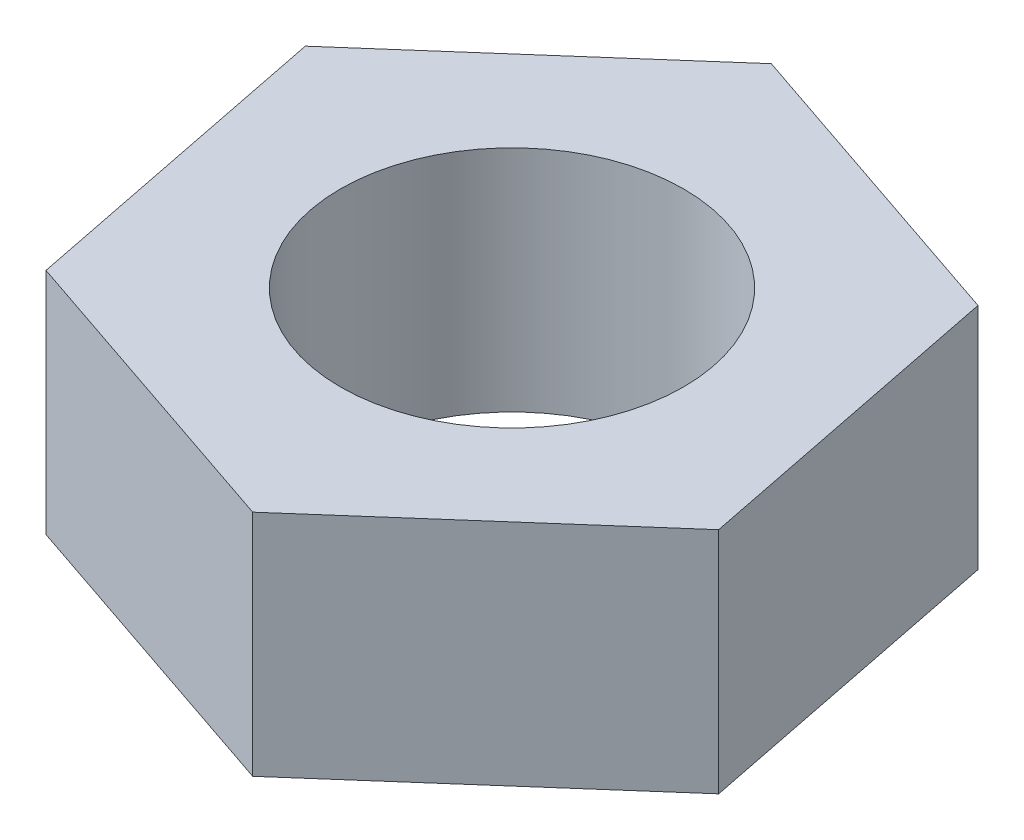
ISO-10303-21;
HEADER;
FILE_DESCRIPTION(('STEP AP214'),'2;1');
FILE_NAME('part.step','',(''),(''),'','','');
FILE_SCHEMA(('AUTOMOTIVE_DESIGN { 1 0 10303 214 1 1 1 1 }'));
ENDSEC;
DATA;
#1=APPLICATION_CONTEXT('core data for automotive mechanical design processes');
#2=APPLICATION_PROTOCOL_DEFINITION('international standard','automotive_design',2000,#1);
#3=PRODUCT_CONTEXT('',#1,'mechanical');
#4=PRODUCT('Part','Part','',(#3));
#5=PRODUCT_RELATED_PRODUCT_CATEGORY('part','',(#4));
#6=PRODUCT_DEFINITION_FORMATION('','',#4);
#7=PRODUCT_DEFINITION_CONTEXT('part definition',#1,'design');
#8=PRODUCT_DEFINITION('design','',#6,#7);
#9=PRODUCT_DEFINITION_SHAPE('','',#8);
#10=(LENGTH_UNIT() NAMED_UNIT(*) SI_UNIT(.MILLI.,.METRE.));
#11=(NAMED_UNIT(*) PLANE_ANGLE_UNIT() SI_UNIT($,.RADIAN.));
#12=(NAMED_UNIT(*) SI_UNIT($,.STERADIAN.) SOLID_ANGLE_UNIT());
#13=UNCERTAINTY_MEASURE_WITH_UNIT(LENGTH_MEASURE(1.E-05),#10,'distance_accuracy_value','');
#14=(GEOMETRIC_REPRESENTATION_CONTEXT(3) GLOBAL_UNCERTAINTY_ASSIGNED_CONTEXT((#13)) GLOBAL_UNIT_ASSIGNED_CONTEXT((#10,
#11,#12)) REPRESENTATION_CONTEXT('',''));
#15=CARTESIAN_POINT('',(0.,0.,0.));
#16=DIRECTION('',(0.,0.,1.));
#17=DIRECTION('',(1.,0.,0.));
#18=AXIS2_PLACEMENT_3D('',#15,#16,#17);
#19=CARTESIAN_POINT('',(8.24528714497441,10.,9.39495821687994));
#20=DIRECTION('',(-0.659622971597953,0.,-0.751596657350395));
#21=DIRECTION('',(-0.751596657350395,0.,0.659622971597953));
#22=AXIS2_PLACEMENT_3D('',#19,#20,#21);
#23=PLANE('',#22);
#24=DIRECTION('',(0.751596657350395,0.,-0.659622971597953));
#25=VECTOR('',#24,1.);
#26=CARTESIAN_POINT('',(8.24528714497441,0.,9.39495821687994));
#27=LINE('',#26,#25);
#28=CARTESIAN_POINT('',(2.82110548943349,0.,14.1553769695767));
#29=VERTEX_POINT('',#28);
#30=CARTESIAN_POINT('',(13.6694688005153,0.,4.6345394641832));
#31=VERTEX_POINT('',#30);
#32=EDGE_CURVE('E124',#29,#31,#27,.T.);
#33=ORIENTED_EDGE('',*,*,#32,.T.);
#34=DIRECTION('',(0.,-1.,0.));
#35=VECTOR('',#34,1.);
#36=CARTESIAN_POINT('',(13.6694688005153,10.,4.6345394641832));
#37=LINE('',#36,#35);
#38=CARTESIAN_POINT('',(13.6694688005153,10.,4.6345394641832));
#39=VERTEX_POINT('',#38);
#40=EDGE_CURVE('E11',#39,#31,#37,.T.);
#41=ORIENTED_EDGE('',*,*,#40,.F.);
#42=DIRECTION('',(0.751596657350395,0.,-0.659622971597953));
#43=VECTOR('',#42,1.);
#44=CARTESIAN_POINT('',(8.24528714497441,10.,9.39495821687994));
#45=LINE('',#44,#43);
#46=CARTESIAN_POINT('',(2.82110548943349,10.,14.1553769695767));
#47=VERTEX_POINT('',#46);
#48=EDGE_CURVE('E147',#47,#39,#45,.T.);
#49=ORIENTED_EDGE('',*,*,#48,.F.);
#50=DIRECTION('',(0.,-1.,0.));
#51=VECTOR('',#50,1.);
#52=CARTESIAN_POINT('',(2.82110548943349,10.,14.1553769695767));
#53=LINE('',#52,#51);
#54=EDGE_CURVE('E117',#47,#29,#53,.T.);
#55=ORIENTED_EDGE('',*,*,#54,.T.);
#56=EDGE_LOOP('',(#33,#41,#49,#55));
#57=FACE_BOUND('',#56,.T.);
#58=ADVANCED_FACE('F36',(#57),#23,.F.);
#59=CARTESIAN_POINT('',(12.2589160557986,10.,-2.44314902060514));
#60=DIRECTION('',(-0.980713284463886,0.,0.195451921648411));
#61=DIRECTION('',(0.195451921648411,0.,0.980713284463886));
#62=AXIS2_PLACEMENT_3D('',#59,#60,#61);
#63=PLANE('',#62);
#64=DIRECTION('',(-0.195451921648411,0.,-0.980713284463886));
#65=VECTOR('',#64,1.);
#66=CARTESIAN_POINT('',(12.2589160557986,0.,-2.44314902060514));
#67=LINE('',#66,#65);
#68=CARTESIAN_POINT('',(10.8483633110818,0.,-9.52083750539347));
#69=VERTEX_POINT('',#68);
#70=EDGE_CURVE('E127',#31,#69,#67,.T.);
#71=ORIENTED_EDGE('',*,*,#70,.T.);
#72=DIRECTION('',(0.,-1.,0.));
#73=VECTOR('',#72,1.);
#74=CARTESIAN_POINT('',(10.8483633110818,10.,-9.52083750539347));
#75=LINE('',#74,#73);
#76=CARTESIAN_POINT('',(10.8483633110818,10.,-9.52083750539347));
#77=VERTEX_POINT('',#76);
#78=EDGE_CURVE('E45',#77,#69,#75,.T.);
#79=ORIENTED_EDGE('',*,*,#78,.F.);
#80=DIRECTION('',(-0.195451921648411,0.,-0.980713284463886));
#81=VECTOR('',#80,1.);
#82=CARTESIAN_POINT('',(12.2589160557986,10.,-2.44314902060514));
#83=LINE('',#82,#81);
#84=EDGE_CURVE('E90',#39,#77,#83,.T.);
#85=ORIENTED_EDGE('',*,*,#84,.F.);
#86=ORIENTED_EDGE('',*,*,#40,.T.);
#87=EDGE_LOOP('',(#71,#79,#85,#86));
#88=FACE_BOUND('',#87,.T.);
#89=ADVANCED_FACE('F161',(#88),#63,.F.);
#90=CARTESIAN_POINT('',(4.01362891082417,10.,-11.8381072374851));
#91=DIRECTION('',(-0.321090312865934,0.,0.947048578998806));
#92=DIRECTION('',(0.947048578998806,0.,0.321090312865934));
#93=AXIS2_PLACEMENT_3D('',#90,#91,#92);
#94=PLANE('',#93);
#95=DIRECTION('',(-0.947048578998806,0.,-0.321090312865934));
#96=VECTOR('',#95,1.);
#97=CARTESIAN_POINT('',(4.01362891082417,0.,-11.8381072374851));
#98=LINE('',#97,#96);
#99=CARTESIAN_POINT('',(-2.82110548943349,0.,-14.1553769695767));
#100=VERTEX_POINT('',#99);
#101=EDGE_CURVE('E129',#69,#100,#98,.T.);
#102=ORIENTED_EDGE('',*,*,#101,.T.);
#103=DIRECTION('',(0.,-1.,0.));
#104=VECTOR('',#103,1.);
#105=CARTESIAN_POINT('',(-2.82110548943349,10.,-14.1553769695767));
#106=LINE('',#105,#104);
#107=CARTESIAN_POINT('',(-2.82110548943349,10.,-14.1553769695767));
#108=VERTEX_POINT('',#107);
#109=EDGE_CURVE('E112',#108,#100,#106,.T.);
#110=ORIENTED_EDGE('',*,*,#109,.F.);
#111=DIRECTION('',(-0.947048578998806,0.,-0.321090312865934));
#112=VECTOR('',#111,1.);
#113=CARTESIAN_POINT('',(4.01362891082417,10.,-11.8381072374851));
#114=LINE('',#113,#112);
#115=EDGE_CURVE('E103',#77,#108,#114,.T.);
#116=ORIENTED_EDGE('',*,*,#115,.F.);
#117=ORIENTED_EDGE('',*,*,#78,.T.);
#118=EDGE_LOOP('',(#102,#110,#116,#117));
#119=FACE_BOUND('',#118,.T.);
#120=ADVANCED_FACE('F140',(#119),#94,.F.);
#121=CARTESIAN_POINT('',(-8.24528714497441,10.,-9.39495821687993));
#122=DIRECTION('',(0.659622971597953,0.,0.751596657350395));
#123=DIRECTION('',(0.751596657350395,0.,-0.659622971597953));
#124=AXIS2_PLACEMENT_3D('',#121,#122,#123);
#125=PLANE('',#124);
#126=DIRECTION('',(-0.751596657350395,0.,0.659622971597953));
#127=VECTOR('',#126,1.);
#128=CARTESIAN_POINT('',(-8.24528714497441,0.,-9.39495821687993));
#129=LINE('',#128,#127);
#130=CARTESIAN_POINT('',(-13.6694688005153,0.,-4.6345394641832));
#131=VERTEX_POINT('',#130);
#132=EDGE_CURVE('E111',#100,#131,#129,.T.);
#133=ORIENTED_EDGE('',*,*,#132,.T.);
#134=DIRECTION('',(0.,-1.,0.));
#135=VECTOR('',#134,1.);
#136=CARTESIAN_POINT('',(-13.6694688005153,10.,-4.6345394641832));
#137=LINE('',#136,#135);
#138=CARTESIAN_POINT('',(-13.6694688005153,10.,-4.6345394641832));
#139=VERTEX_POINT('',#138);
#140=EDGE_CURVE('E108',#139,#131,#137,.T.);
#141=ORIENTED_EDGE('',*,*,#140,.F.);
#142=DIRECTION('',(-0.751596657350395,0.,0.659622971597953));
#143=VECTOR('',#142,1.);
#144=CARTESIAN_POINT('',(-8.24528714497441,10.,-9.39495821687993));
#145=LINE('',#144,#143);
#146=EDGE_CURVE('E97',#108,#139,#145,.T.);
#147=ORIENTED_EDGE('',*,*,#146,.F.);
#148=ORIENTED_EDGE('',*,*,#109,.T.);
#149=EDGE_LOOP('',(#133,#141,#147,#148));
#150=FACE_BOUND('',#149,.T.);
#151=ADVANCED_FACE('F109',(#150),#125,.F.);
#152=CARTESIAN_POINT('',(-12.2589160557986,10.,2.44314902060514));
#153=DIRECTION('',(0.980713284463886,0.,-0.195451921648411));
#154=DIRECTION('',(-0.195451921648411,0.,-0.980713284463886));
#155=AXIS2_PLACEMENT_3D('',#152,#153,#154);
#156=PLANE('',#155);
#157=DIRECTION('',(0.195451921648411,0.,0.980713284463886));
#158=VECTOR('',#157,1.);
#159=CARTESIAN_POINT('',(-12.2589160557986,0.,2.44314902060514));
#160=LINE('',#159,#158);
#161=CARTESIAN_POINT('',(-10.8483633110818,0.,9.52083750539348));
#162=VERTEX_POINT('',#161);
#163=EDGE_CURVE('E76',#131,#162,#160,.T.);
#164=ORIENTED_EDGE('',*,*,#163,.T.);
#165=DIRECTION('',(0.,-1.,0.));
#166=VECTOR('',#165,1.);
#167=CARTESIAN_POINT('',(-10.8483633110818,10.,9.52083750539348));
#168=LINE('',#167,#166);
#169=CARTESIAN_POINT('',(-10.8483633110818,10.,9.52083750539348));
#170=VERTEX_POINT('',#169);
#171=EDGE_CURVE('E113',#170,#162,#168,.T.);
#172=ORIENTED_EDGE('',*,*,#171,.F.);
#173=DIRECTION('',(0.195451921648411,0.,0.980713284463886));
#174=VECTOR('',#173,1.);
#175=CARTESIAN_POINT('',(-12.2589160557986,10.,2.44314902060514));
#176=LINE('',#175,#174);
#177=EDGE_CURVE('E101',#139,#170,#176,.T.);
#178=ORIENTED_EDGE('',*,*,#177,.F.);
#179=ORIENTED_EDGE('',*,*,#140,.T.);
#180=EDGE_LOOP('',(#164,#172,#178,#179));
#181=FACE_BOUND('',#180,.T.);
#182=ADVANCED_FACE('F115',(#181),#156,.F.);
#183=CARTESIAN_POINT('',(0.,10.,0.));
#184=DIRECTION('',(0.,-1.,0.));
#185=DIRECTION('',(0.,0.,-1.));
#186=AXIS2_PLACEMENT_3D('',#183,#184,#185);
#187=CYLINDRICAL_SURFACE('',#186,7.5);
#188=CARTESIAN_POINT('',(0.,10.,0.));
#189=DIRECTION('',(0.,1.,0.));
#190=DIRECTION('',(0.,0.,1.));
#191=AXIS2_PLACEMENT_3D('',#188,#189,#190);
#192=CIRCLE('',#191,7.5);
#193=CARTESIAN_POINT('',(0.,10.,7.5));
#194=VERTEX_POINT('',#193);
#195=EDGE_CURVE('E134',#194,#194,#192,.T.);
#196=ORIENTED_EDGE('',*,*,#195,.T.);
#197=EDGE_LOOP('',(#196));
#198=FACE_BOUND('',#197,.T.);
#199=CARTESIAN_POINT('',(0.,0.,0.));
#200=DIRECTION('',(0.,1.,0.));
#201=DIRECTION('',(0.,0.,1.));
#202=AXIS2_PLACEMENT_3D('',#199,#200,#201);
#203=CIRCLE('',#202,7.5);
#204=CARTESIAN_POINT('',(0.,0.,7.5));
#205=VERTEX_POINT('',#204);
#206=EDGE_CURVE('E121',#205,#205,#203,.T.);
#207=ORIENTED_EDGE('',*,*,#206,.F.);
#208=EDGE_LOOP('',(#207));
#209=FACE_BOUND('',#208,.T.);
#210=ADVANCED_FACE('F38',(#198,#209),#187,.F.);
#211=CARTESIAN_POINT('',(-4.01362891082417,10.,11.8381072374851));
#212=DIRECTION('',(0.321090312865934,0.,-0.947048578998806));
#213=DIRECTION('',(-0.947048578998806,0.,-0.321090312865934));
#214=AXIS2_PLACEMENT_3D('',#211,#212,#213);
#215=PLANE('',#214);
#216=DIRECTION('',(0.947048578998806,0.,0.321090312865934));
#217=VECTOR('',#216,1.);
#218=CARTESIAN_POINT('',(-4.01362891082417,0.,11.8381072374851));
#219=LINE('',#218,#217);
#220=EDGE_CURVE('E82',#162,#29,#219,.T.);
#221=ORIENTED_EDGE('',*,*,#220,.T.);
#222=ORIENTED_EDGE('',*,*,#54,.F.);
#223=DIRECTION('',(0.947048578998806,0.,0.321090312865934));
#224=VECTOR('',#223,1.);
#225=CARTESIAN_POINT('',(-4.01362891082417,10.,11.8381072374851));
#226=LINE('',#225,#224);
#227=EDGE_CURVE('E53',#170,#47,#226,.T.);
#228=ORIENTED_EDGE('',*,*,#227,.F.);
#229=ORIENTED_EDGE('',*,*,#171,.T.);
#230=EDGE_LOOP('',(#221,#222,#228,#229));
#231=FACE_BOUND('',#230,.T.);
#232=ADVANCED_FACE('F148',(#231),#215,.F.);
#233=CARTESIAN_POINT('',(0.,10.,0.));
#234=DIRECTION('',(0.,1.,0.));
#235=DIRECTION('',(0.,0.,1.));
#236=AXIS2_PLACEMENT_3D('',#233,#234,#235);
#237=PLANE('',#236);
#238=ORIENTED_EDGE('',*,*,#195,.F.);
#239=EDGE_LOOP('',(#238));
#240=FACE_BOUND('',#239,.T.);
#241=ORIENTED_EDGE('',*,*,#48,.T.);
#242=ORIENTED_EDGE('',*,*,#84,.T.);
#243=ORIENTED_EDGE('',*,*,#115,.T.);
#244=ORIENTED_EDGE('',*,*,#146,.T.);
#245=ORIENTED_EDGE('',*,*,#177,.T.);
#246=ORIENTED_EDGE('',*,*,#227,.T.);
#247=EDGE_LOOP('',(#241,#242,#243,#244,#245,#246));
#248=FACE_BOUND('',#247,.T.);
#249=ADVANCED_FACE('F99',(#240,#248),#237,.T.);
#250=CARTESIAN_POINT('',(0.,0.,0.));
#251=DIRECTION('',(0.,1.,0.));
#252=DIRECTION('',(0.,0.,1.));
#253=AXIS2_PLACEMENT_3D('',#250,#251,#252);
#254=PLANE('',#253);
#255=ORIENTED_EDGE('',*,*,#206,.T.);
#256=EDGE_LOOP('',(#255));
#257=FACE_BOUND('',#256,.T.);
#258=ORIENTED_EDGE('',*,*,#32,.F.);
#259=ORIENTED_EDGE('',*,*,#220,.F.);
#260=ORIENTED_EDGE('',*,*,#163,.F.);
#261=ORIENTED_EDGE('',*,*,#132,.F.);
#262=ORIENTED_EDGE('',*,*,#101,.F.);
#263=ORIENTED_EDGE('',*,*,#70,.F.);
#264=EDGE_LOOP('',(#258,#259,#260,#261,#262,#263));
#265=FACE_BOUND('',#264,.T.);
#266=ADVANCED_FACE('F143',(#257,#265),#254,.F.);
#267=CLOSED_SHELL('',(#58,#89,#120,#151,#182,#210,#232,#249,#266));
#268=MANIFOLD_SOLID_BREP('B2',#267);
#269=ADVANCED_BREP_SHAPE_REPRESENTATION('',(#18,#268),#14);
#270=SHAPE_DEFINITION_REPRESENTATION(#9,#269);
ENDSEC;
END-ISO-10303-21;
